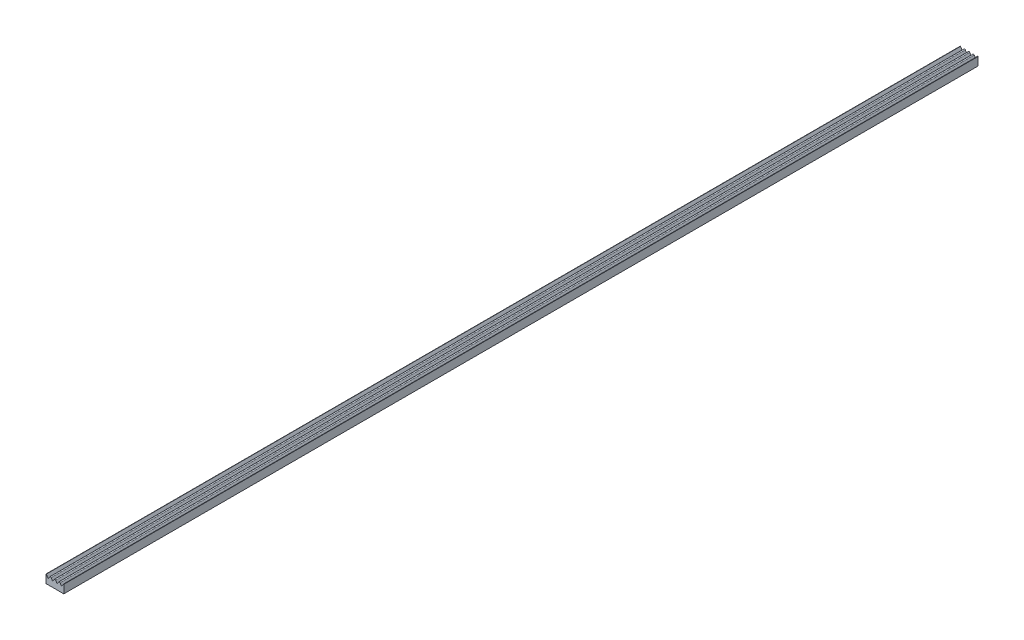
ISO-10303-21;
HEADER;
FILE_DESCRIPTION(('STEP AP214'),'2;1');
FILE_NAME('part.step','',(''),(''),'','','');
FILE_SCHEMA(('AUTOMOTIVE_DESIGN { 1 0 10303 214 1 1 1 1 }'));
ENDSEC;
DATA;
#1=APPLICATION_CONTEXT('core data for automotive mechanical design processes');
#2=APPLICATION_PROTOCOL_DEFINITION('international standard','automotive_design',2000,#1);
#3=PRODUCT_CONTEXT('',#1,'mechanical');
#4=PRODUCT('Part','Part','',(#3));
#5=PRODUCT_RELATED_PRODUCT_CATEGORY('part','',(#4));
#6=PRODUCT_DEFINITION_FORMATION('','',#4);
#7=PRODUCT_DEFINITION_CONTEXT('part definition',#1,'design');
#8=PRODUCT_DEFINITION('design','',#6,#7);
#9=PRODUCT_DEFINITION_SHAPE('','',#8);
#10=(LENGTH_UNIT() NAMED_UNIT(*) SI_UNIT(.MILLI.,.METRE.));
#11=(NAMED_UNIT(*) PLANE_ANGLE_UNIT() SI_UNIT($,.RADIAN.));
#12=(NAMED_UNIT(*) SI_UNIT($,.STERADIAN.) SOLID_ANGLE_UNIT());
#13=UNCERTAINTY_MEASURE_WITH_UNIT(LENGTH_MEASURE(1.E-05),#10,'distance_accuracy_value','');
#14=(GEOMETRIC_REPRESENTATION_CONTEXT(3) GLOBAL_UNCERTAINTY_ASSIGNED_CONTEXT((#13)) GLOBAL_UNIT_ASSIGNED_CONTEXT((#10,
#11,#12)) REPRESENTATION_CONTEXT('',''));
#15=CARTESIAN_POINT('',(0.,0.,0.));
#16=DIRECTION('',(0.,0.,1.));
#17=DIRECTION('',(1.,0.,0.));
#18=AXIS2_PLACEMENT_3D('',#15,#16,#17);
#19=CARTESIAN_POINT('',(0.,0.,652.145));
#20=DIRECTION('',(-1.,0.,0.));
#21=DIRECTION('',(0.,0.,1.));
#22=AXIS2_PLACEMENT_3D('',#19,#20,#21);
#23=PLANE('',#22);
#24=DIRECTION('',(0.,1.,0.));
#25=VECTOR('',#24,1.);
#26=CARTESIAN_POINT('',(0.,0.,0.));
#27=LINE('',#26,#25);
#28=CARTESIAN_POINT('',(0.,0.,0.));
#29=VERTEX_POINT('',#28);
#30=CARTESIAN_POINT('',(0.,5.90717687924576,0.));
#31=VERTEX_POINT('',#30);
#32=EDGE_CURVE('E177',#29,#31,#27,.T.);
#33=ORIENTED_EDGE('',*,*,#32,.T.);
#34=DIRECTION('',(0.,0.,-1.));
#35=VECTOR('',#34,1.);
#36=CARTESIAN_POINT('',(0.,5.90717687924576,652.145));
#37=LINE('',#36,#35);
#38=CARTESIAN_POINT('',(0.,5.90717687924576,652.145));
#39=VERTEX_POINT('',#38);
#40=EDGE_CURVE('E11',#39,#31,#37,.T.);
#41=ORIENTED_EDGE('',*,*,#40,.F.);
#42=DIRECTION('',(0.,1.,0.));
#43=VECTOR('',#42,1.);
#44=CARTESIAN_POINT('',(0.,0.,652.145));
#45=LINE('',#44,#43);
#46=CARTESIAN_POINT('',(0.,0.,652.145));
#47=VERTEX_POINT('',#46);
#48=EDGE_CURVE('E207',#47,#39,#45,.T.);
#49=ORIENTED_EDGE('',*,*,#48,.F.);
#50=DIRECTION('',(0.,0.,-1.));
#51=VECTOR('',#50,1.);
#52=CARTESIAN_POINT('',(0.,0.,652.145));
#53=LINE('',#52,#51);
#54=EDGE_CURVE('E173',#47,#29,#53,.T.);
#55=ORIENTED_EDGE('',*,*,#54,.T.);
#56=EDGE_LOOP('',(#33,#41,#49,#55));
#57=FACE_BOUND('',#56,.T.);
#58=ADVANCED_FACE('F33',(#57),#23,.F.);
#59=CARTESIAN_POINT('',(-0.127,5.90717687924576,652.145));
#60=DIRECTION('',(0.,0.,-1.));
#61=DIRECTION('',(-1.,0.,0.));
#62=AXIS2_PLACEMENT_3D('',#59,#60,#61);
#63=CYLINDRICAL_SURFACE('',#62,0.127);
#64=CARTESIAN_POINT('',(-0.127,5.90717687924576,0.));
#65=DIRECTION('',(0.,0.,1.));
#66=DIRECTION('',(1.,0.,0.));
#67=AXIS2_PLACEMENT_3D('',#64,#65,#66);
#68=CIRCLE('',#67,0.127);
#69=CARTESIAN_POINT('',(-0.234695784608649,5.97448674462616,0.));
#70=VERTEX_POINT('',#69);
#71=EDGE_CURVE('E180',#31,#70,#68,.T.);
#72=ORIENTED_EDGE('',*,*,#71,.T.);
#73=DIRECTION('',(0.,0.,-1.));
#74=VECTOR('',#73,1.);
#75=CARTESIAN_POINT('',(-0.234695784608649,5.97448674462616,652.145));
#76=LINE('',#75,#74);
#77=CARTESIAN_POINT('',(-0.234695784608649,5.97448674462616,652.145));
#78=VERTEX_POINT('',#77);
#79=EDGE_CURVE('E41',#78,#70,#76,.T.);
#80=ORIENTED_EDGE('',*,*,#79,.F.);
#81=CARTESIAN_POINT('',(-0.127,5.90717687924576,652.145));
#82=DIRECTION('',(0.,0.,1.));
#83=DIRECTION('',(1.,0.,0.));
#84=AXIS2_PLACEMENT_3D('',#81,#82,#83);
#85=CIRCLE('',#84,0.127);
#86=EDGE_CURVE('E116',#39,#78,#85,.T.);
#87=ORIENTED_EDGE('',*,*,#86,.F.);
#88=ORIENTED_EDGE('',*,*,#40,.T.);
#89=EDGE_LOOP('',(#72,#80,#87,#88));
#90=FACE_BOUND('',#89,.T.);
#91=ADVANCED_FACE('F305',(#90),#63,.T.);
#92=CARTESIAN_POINT('',(-1.5875,3.81,652.145));
#93=DIRECTION('',(0.847998304005088,-0.529998940003179,0.));
#94=DIRECTION('',(0.529998940003179,0.847998304005088,0.));
#95=AXIS2_PLACEMENT_3D('',#92,#93,#94);
#96=PLANE('',#95);
#97=DIRECTION('',(-0.529998940003179,-0.847998304005088,0.));
#98=VECTOR('',#97,1.);
#99=CARTESIAN_POINT('',(-1.5875,3.81,0.));
#100=LINE('',#99,#98);
#101=CARTESIAN_POINT('',(-1.5875,3.81,0.));
#102=VERTEX_POINT('',#101);
#103=EDGE_CURVE('E182',#70,#102,#100,.T.);
#104=ORIENTED_EDGE('',*,*,#103,.T.);
#105=DIRECTION('',(0.,0.,-1.));
#106=VECTOR('',#105,1.);
#107=CARTESIAN_POINT('',(-1.5875,3.81,652.145));
#108=LINE('',#107,#106);
#109=CARTESIAN_POINT('',(-1.5875,3.81,652.145));
#110=VERTEX_POINT('',#109);
#111=EDGE_CURVE('E238',#110,#102,#108,.T.);
#112=ORIENTED_EDGE('',*,*,#111,.F.);
#113=DIRECTION('',(-0.529998940003179,-0.847998304005088,0.));
#114=VECTOR('',#113,1.);
#115=CARTESIAN_POINT('',(-1.5875,3.81,652.145));
#116=LINE('',#115,#114);
#117=EDGE_CURVE('E246',#78,#110,#116,.T.);
#118=ORIENTED_EDGE('',*,*,#117,.F.);
#119=ORIENTED_EDGE('',*,*,#79,.T.);
#120=EDGE_LOOP('',(#104,#112,#118,#119));
#121=FACE_BOUND('',#120,.T.);
#122=ADVANCED_FACE('F244',(#121),#96,.F.);
#123=CARTESIAN_POINT('',(-2.63652107695677,5.48843372313082,652.145));
#124=DIRECTION('',(-0.847998304005088,-0.52999894000318,0.));
#125=DIRECTION('',(0.52999894000318,-0.847998304005088,0.));
#126=AXIS2_PLACEMENT_3D('',#123,#124,#125);
#127=PLANE('',#126);
#128=DIRECTION('',(-0.52999894000318,0.847998304005088,0.));
#129=VECTOR('',#128,1.);
#130=CARTESIAN_POINT('',(-2.63652107695677,5.48843372313082,0.));
#131=LINE('',#130,#129);
#132=CARTESIAN_POINT('',(-2.63652107695677,5.48843372313082,0.));
#133=VERTEX_POINT('',#132);
#134=EDGE_CURVE('E184',#102,#133,#131,.T.);
#135=ORIENTED_EDGE('',*,*,#134,.T.);
#136=DIRECTION('',(0.,0.,-1.));
#137=VECTOR('',#136,1.);
#138=CARTESIAN_POINT('',(-2.63652107695677,5.48843372313082,652.145));
#139=LINE('',#138,#137);
#140=CARTESIAN_POINT('',(-2.63652107695677,5.48843372313082,652.145));
#141=VERTEX_POINT('',#140);
#142=EDGE_CURVE('E235',#141,#133,#139,.T.);
#143=ORIENTED_EDGE('',*,*,#142,.F.);
#144=DIRECTION('',(-0.52999894000318,0.847998304005088,0.));
#145=VECTOR('',#144,1.);
#146=CARTESIAN_POINT('',(-2.63652107695677,5.48843372313082,652.145));
#147=LINE('',#146,#145);
#148=EDGE_CURVE('E264',#110,#141,#147,.T.);
#149=ORIENTED_EDGE('',*,*,#148,.F.);
#150=ORIENTED_EDGE('',*,*,#111,.T.);
#151=EDGE_LOOP('',(#135,#143,#149,#150));
#152=FACE_BOUND('',#151,.T.);
#153=ADVANCED_FACE('F255',(#152),#127,.F.);
#154=CARTESIAN_POINT('',(-3.175,5.15188439622881,652.145));
#155=DIRECTION('',(0.,0.,-1.));
#156=DIRECTION('',(-1.,0.,0.));
#157=AXIS2_PLACEMENT_3D('',#154,#155,#156);
#158=CYLINDRICAL_SURFACE('',#157,0.635);
#159=CARTESIAN_POINT('',(-3.175,5.15188439622881,0.));
#160=DIRECTION('',(0.,0.,1.));
#161=DIRECTION('',(-1.,0.,0.));
#162=AXIS2_PLACEMENT_3D('',#159,#160,#161);
#163=CIRCLE('',#162,0.635);
#164=CARTESIAN_POINT('',(-3.71347892304324,5.48843372313082,0.));
#165=VERTEX_POINT('',#164);
#166=EDGE_CURVE('E186',#133,#165,#163,.T.);
#167=ORIENTED_EDGE('',*,*,#166,.T.);
#168=DIRECTION('',(0.,0.,-1.));
#169=VECTOR('',#168,1.);
#170=CARTESIAN_POINT('',(-3.71347892304324,5.48843372313082,652.145));
#171=LINE('',#170,#169);
#172=CARTESIAN_POINT('',(-3.71347892304324,5.48843372313082,652.145));
#173=VERTEX_POINT('',#172);
#174=EDGE_CURVE('E232',#173,#165,#171,.T.);
#175=ORIENTED_EDGE('',*,*,#174,.F.);
#176=CARTESIAN_POINT('',(-3.175,5.15188439622881,652.145));
#177=DIRECTION('',(0.,0.,1.));
#178=DIRECTION('',(-1.,0.,0.));
#179=AXIS2_PLACEMENT_3D('',#176,#177,#178);
#180=CIRCLE('',#179,0.635);
#181=EDGE_CURVE('E261',#141,#173,#180,.T.);
#182=ORIENTED_EDGE('',*,*,#181,.F.);
#183=ORIENTED_EDGE('',*,*,#142,.T.);
#184=EDGE_LOOP('',(#167,#175,#182,#183));
#185=FACE_BOUND('',#184,.T.);
#186=ADVANCED_FACE('F259',(#185),#158,.T.);
#187=CARTESIAN_POINT('',(-4.7625,3.81,652.145));
#188=DIRECTION('',(0.847998304005088,-0.52999894000318,0.));
#189=DIRECTION('',(0.52999894000318,0.847998304005088,0.));
#190=AXIS2_PLACEMENT_3D('',#187,#188,#189);
#191=PLANE('',#190);
#192=DIRECTION('',(-0.52999894000318,-0.847998304005088,0.));
#193=VECTOR('',#192,1.);
#194=CARTESIAN_POINT('',(-4.7625,3.81,0.));
#195=LINE('',#194,#193);
#196=CARTESIAN_POINT('',(-4.7625,3.81,0.));
#197=VERTEX_POINT('',#196);
#198=EDGE_CURVE('E188',#165,#197,#195,.T.);
#199=ORIENTED_EDGE('',*,*,#198,.T.);
#200=DIRECTION('',(0.,0.,-1.));
#201=VECTOR('',#200,1.);
#202=CARTESIAN_POINT('',(-4.7625,3.81,652.145));
#203=LINE('',#202,#201);
#204=CARTESIAN_POINT('',(-4.7625,3.81,652.145));
#205=VERTEX_POINT('',#204);
#206=EDGE_CURVE('E229',#205,#197,#203,.T.);
#207=ORIENTED_EDGE('',*,*,#206,.F.);
#208=DIRECTION('',(-0.52999894000318,-0.847998304005088,0.));
#209=VECTOR('',#208,1.);
#210=CARTESIAN_POINT('',(-4.7625,3.81,652.145));
#211=LINE('',#210,#209);
#212=EDGE_CURVE('E263',#173,#205,#211,.T.);
#213=ORIENTED_EDGE('',*,*,#212,.F.);
#214=ORIENTED_EDGE('',*,*,#174,.T.);
#215=EDGE_LOOP('',(#199,#207,#213,#214));
#216=FACE_BOUND('',#215,.T.);
#217=ADVANCED_FACE('F318',(#216),#191,.F.);
#218=CARTESIAN_POINT('',(-4.7625,3.81,652.145));
#219=DIRECTION('',(-0.847998304005088,-0.52999894000318,0.));
#220=DIRECTION('',(0.52999894000318,-0.847998304005088,0.));
#221=AXIS2_PLACEMENT_3D('',#218,#219,#220);
#222=PLANE('',#221);
#223=DIRECTION('',(-0.52999894000318,0.847998304005088,0.));
#224=VECTOR('',#223,1.);
#225=CARTESIAN_POINT('',(-4.7625,3.81,0.));
#226=LINE('',#225,#224);
#227=CARTESIAN_POINT('',(-5.81152107695676,5.48843372313082,0.));
#228=VERTEX_POINT('',#227);
#229=EDGE_CURVE('E190',#197,#228,#226,.T.);
#230=ORIENTED_EDGE('',*,*,#229,.T.);
#231=DIRECTION('',(0.,0.,-1.));
#232=VECTOR('',#231,1.);
#233=CARTESIAN_POINT('',(-5.81152107695676,5.48843372313082,652.145));
#234=LINE('',#233,#232);
#235=CARTESIAN_POINT('',(-5.81152107695676,5.48843372313082,652.145));
#236=VERTEX_POINT('',#235);
#237=EDGE_CURVE('E226',#236,#228,#234,.T.);
#238=ORIENTED_EDGE('',*,*,#237,.F.);
#239=DIRECTION('',(-0.52999894000318,0.847998304005088,0.));
#240=VECTOR('',#239,1.);
#241=CARTESIAN_POINT('',(-4.7625,3.81,652.145));
#242=LINE('',#241,#240);
#243=EDGE_CURVE('E266',#205,#236,#242,.T.);
#244=ORIENTED_EDGE('',*,*,#243,.F.);
#245=ORIENTED_EDGE('',*,*,#206,.T.);
#246=EDGE_LOOP('',(#230,#238,#244,#245));
#247=FACE_BOUND('',#246,.T.);
#248=ADVANCED_FACE('F321',(#247),#222,.F.);
#249=CARTESIAN_POINT('',(-6.35,5.15188439622881,652.145));
#250=DIRECTION('',(0.,0.,-1.));
#251=DIRECTION('',(-1.,0.,0.));
#252=AXIS2_PLACEMENT_3D('',#249,#250,#251);
#253=CYLINDRICAL_SURFACE('',#252,0.635);
#254=CARTESIAN_POINT('',(-6.35,5.15188439622881,0.));
#255=DIRECTION('',(0.,0.,1.));
#256=DIRECTION('',(-1.,0.,0.));
#257=AXIS2_PLACEMENT_3D('',#254,#255,#256);
#258=CIRCLE('',#257,0.635);
#259=CARTESIAN_POINT('',(-6.88847892304323,5.48843372313082,0.));
#260=VERTEX_POINT('',#259);
#261=EDGE_CURVE('E192',#228,#260,#258,.T.);
#262=ORIENTED_EDGE('',*,*,#261,.T.);
#263=DIRECTION('',(0.,0.,-1.));
#264=VECTOR('',#263,1.);
#265=CARTESIAN_POINT('',(-6.88847892304323,5.48843372313082,652.145));
#266=LINE('',#265,#264);
#267=CARTESIAN_POINT('',(-6.88847892304323,5.48843372313082,652.145));
#268=VERTEX_POINT('',#267);
#269=EDGE_CURVE('E223',#268,#260,#266,.T.);
#270=ORIENTED_EDGE('',*,*,#269,.F.);
#271=CARTESIAN_POINT('',(-6.35,5.15188439622881,652.145));
#272=DIRECTION('',(0.,0.,1.));
#273=DIRECTION('',(-1.,0.,0.));
#274=AXIS2_PLACEMENT_3D('',#271,#272,#273);
#275=CIRCLE('',#274,0.635);
#276=EDGE_CURVE('E272',#236,#268,#275,.T.);
#277=ORIENTED_EDGE('',*,*,#276,.F.);
#278=ORIENTED_EDGE('',*,*,#237,.T.);
#279=EDGE_LOOP('',(#262,#270,#277,#278));
#280=FACE_BOUND('',#279,.T.);
#281=ADVANCED_FACE('F325',(#280),#253,.T.);
#282=CARTESIAN_POINT('',(-7.9375,3.81,652.145));
#283=DIRECTION('',(0.847998304005088,-0.52999894000318,0.));
#284=DIRECTION('',(0.52999894000318,0.847998304005088,0.));
#285=AXIS2_PLACEMENT_3D('',#282,#283,#284);
#286=PLANE('',#285);
#287=DIRECTION('',(-0.52999894000318,-0.847998304005088,0.));
#288=VECTOR('',#287,1.);
#289=CARTESIAN_POINT('',(-7.9375,3.81,0.));
#290=LINE('',#289,#288);
#291=CARTESIAN_POINT('',(-7.9375,3.81,0.));
#292=VERTEX_POINT('',#291);
#293=EDGE_CURVE('E194',#260,#292,#290,.T.);
#294=ORIENTED_EDGE('',*,*,#293,.T.);
#295=DIRECTION('',(0.,0.,-1.));
#296=VECTOR('',#295,1.);
#297=CARTESIAN_POINT('',(-7.9375,3.81,652.145));
#298=LINE('',#297,#296);
#299=CARTESIAN_POINT('',(-7.9375,3.81,652.145));
#300=VERTEX_POINT('',#299);
#301=EDGE_CURVE('E220',#300,#292,#298,.T.);
#302=ORIENTED_EDGE('',*,*,#301,.F.);
#303=DIRECTION('',(-0.52999894000318,-0.847998304005088,0.));
#304=VECTOR('',#303,1.);
#305=CARTESIAN_POINT('',(-7.9375,3.81,652.145));
#306=LINE('',#305,#304);
#307=EDGE_CURVE('E274',#268,#300,#306,.T.);
#308=ORIENTED_EDGE('',*,*,#307,.F.);
#309=ORIENTED_EDGE('',*,*,#269,.T.);
#310=EDGE_LOOP('',(#294,#302,#308,#309));
#311=FACE_BOUND('',#310,.T.);
#312=ADVANCED_FACE('F329',(#311),#286,.F.);
#313=CARTESIAN_POINT('',(-7.9375,3.81,652.145));
#314=DIRECTION('',(-0.847998304005088,-0.52999894000318,0.));
#315=DIRECTION('',(0.52999894000318,-0.847998304005088,0.));
#316=AXIS2_PLACEMENT_3D('',#313,#314,#315);
#317=PLANE('',#316);
#318=DIRECTION('',(-0.52999894000318,0.847998304005088,0.));
#319=VECTOR('',#318,1.);
#320=CARTESIAN_POINT('',(-7.9375,3.81,0.));
#321=LINE('',#320,#319);
#322=CARTESIAN_POINT('',(-8.98652107695676,5.48843372313082,0.));
#323=VERTEX_POINT('',#322);
#324=EDGE_CURVE('E196',#292,#323,#321,.T.);
#325=ORIENTED_EDGE('',*,*,#324,.T.);
#326=DIRECTION('',(0.,0.,-1.));
#327=VECTOR('',#326,1.);
#328=CARTESIAN_POINT('',(-8.98652107695676,5.48843372313082,652.145));
#329=LINE('',#328,#327);
#330=CARTESIAN_POINT('',(-8.98652107695676,5.48843372313082,652.145));
#331=VERTEX_POINT('',#330);
#332=EDGE_CURVE('E217',#331,#323,#329,.T.);
#333=ORIENTED_EDGE('',*,*,#332,.F.);
#334=DIRECTION('',(-0.52999894000318,0.847998304005088,0.));
#335=VECTOR('',#334,1.);
#336=CARTESIAN_POINT('',(-7.9375,3.81,652.145));
#337=LINE('',#336,#335);
#338=EDGE_CURVE('E276',#300,#331,#337,.T.);
#339=ORIENTED_EDGE('',*,*,#338,.F.);
#340=ORIENTED_EDGE('',*,*,#301,.T.);
#341=EDGE_LOOP('',(#325,#333,#339,#340));
#342=FACE_BOUND('',#341,.T.);
#343=ADVANCED_FACE('F333',(#342),#317,.F.);
#344=CARTESIAN_POINT('',(-9.525,5.15188439622881,652.145));
#345=DIRECTION('',(0.,0.,-1.));
#346=DIRECTION('',(-1.,0.,0.));
#347=AXIS2_PLACEMENT_3D('',#344,#345,#346);
#348=CYLINDRICAL_SURFACE('',#347,0.635);
#349=CARTESIAN_POINT('',(-9.525,5.15188439622881,0.));
#350=DIRECTION('',(0.,0.,1.));
#351=DIRECTION('',(1.,0.,0.));
#352=AXIS2_PLACEMENT_3D('',#349,#350,#351);
#353=CIRCLE('',#352,0.635);
#354=CARTESIAN_POINT('',(-10.0634789230432,5.48843372313082,0.));
#355=VERTEX_POINT('',#354);
#356=EDGE_CURVE('E198',#323,#355,#353,.T.);
#357=ORIENTED_EDGE('',*,*,#356,.T.);
#358=DIRECTION('',(0.,0.,-1.));
#359=VECTOR('',#358,1.);
#360=CARTESIAN_POINT('',(-10.0634789230432,5.48843372313082,652.145));
#361=LINE('',#360,#359);
#362=CARTESIAN_POINT('',(-10.0634789230432,5.48843372313082,652.145));
#363=VERTEX_POINT('',#362);
#364=EDGE_CURVE('E214',#363,#355,#361,.T.);
#365=ORIENTED_EDGE('',*,*,#364,.F.);
#366=CARTESIAN_POINT('',(-9.525,5.15188439622881,652.145));
#367=DIRECTION('',(0.,0.,1.));
#368=DIRECTION('',(1.,0.,0.));
#369=AXIS2_PLACEMENT_3D('',#366,#367,#368);
#370=CIRCLE('',#369,0.635);
#371=EDGE_CURVE('E278',#331,#363,#370,.T.);
#372=ORIENTED_EDGE('',*,*,#371,.F.);
#373=ORIENTED_EDGE('',*,*,#332,.T.);
#374=EDGE_LOOP('',(#357,#365,#372,#373));
#375=FACE_BOUND('',#374,.T.);
#376=ADVANCED_FACE('F337',(#375),#348,.T.);
#377=CARTESIAN_POINT('',(-10.0634789230432,5.48843372313082,652.145));
#378=DIRECTION('',(0.847998304005088,-0.52999894000318,0.));
#379=DIRECTION('',(0.52999894000318,0.847998304005088,0.));
#380=AXIS2_PLACEMENT_3D('',#377,#378,#379);
#381=PLANE('',#380);
#382=DIRECTION('',(-0.52999894000318,-0.847998304005088,0.));
#383=VECTOR('',#382,1.);
#384=CARTESIAN_POINT('',(-10.0634789230432,5.48843372313082,0.));
#385=LINE('',#384,#383);
#386=CARTESIAN_POINT('',(-11.1125,3.81,0.));
#387=VERTEX_POINT('',#386);
#388=EDGE_CURVE('E200',#355,#387,#385,.T.);
#389=ORIENTED_EDGE('',*,*,#388,.T.);
#390=DIRECTION('',(0.,0.,-1.));
#391=VECTOR('',#390,1.);
#392=CARTESIAN_POINT('',(-11.1125,3.81,652.145));
#393=LINE('',#392,#391);
#394=CARTESIAN_POINT('',(-11.1125,3.81,652.145));
#395=VERTEX_POINT('',#394);
#396=EDGE_CURVE('E211',#395,#387,#393,.T.);
#397=ORIENTED_EDGE('',*,*,#396,.F.);
#398=DIRECTION('',(-0.52999894000318,-0.847998304005088,0.));
#399=VECTOR('',#398,1.);
#400=CARTESIAN_POINT('',(-10.0634789230432,5.48843372313082,652.145));
#401=LINE('',#400,#399);
#402=EDGE_CURVE('E280',#363,#395,#401,.T.);
#403=ORIENTED_EDGE('',*,*,#402,.F.);
#404=ORIENTED_EDGE('',*,*,#364,.T.);
#405=EDGE_LOOP('',(#389,#397,#403,#404));
#406=FACE_BOUND('',#405,.T.);
#407=ADVANCED_FACE('F286',(#406),#381,.F.);
#408=CARTESIAN_POINT('',(-11.1125,3.81,652.145));
#409=DIRECTION('',(-0.847998304005088,-0.52999894000318,0.));
#410=DIRECTION('',(0.52999894000318,-0.847998304005088,0.));
#411=AXIS2_PLACEMENT_3D('',#408,#409,#410);
#412=PLANE('',#411);
#413=DIRECTION('',(-0.52999894000318,0.847998304005088,0.));
#414=VECTOR('',#413,1.);
#415=CARTESIAN_POINT('',(-11.1125,3.81,0.));
#416=LINE('',#415,#414);
#417=CARTESIAN_POINT('',(-12.4653042153914,5.97448674462616,0.));
#418=VERTEX_POINT('',#417);
#419=EDGE_CURVE('E202',#387,#418,#416,.T.);
#420=ORIENTED_EDGE('',*,*,#419,.T.);
#421=DIRECTION('',(0.,0.,-1.));
#422=VECTOR('',#421,1.);
#423=CARTESIAN_POINT('',(-12.4653042153914,5.97448674462616,652.145));
#424=LINE('',#423,#422);
#425=CARTESIAN_POINT('',(-12.4653042153914,5.97448674462616,652.145));
#426=VERTEX_POINT('',#425);
#427=EDGE_CURVE('E168',#426,#418,#424,.T.);
#428=ORIENTED_EDGE('',*,*,#427,.F.);
#429=DIRECTION('',(-0.52999894000318,0.847998304005088,0.));
#430=VECTOR('',#429,1.);
#431=CARTESIAN_POINT('',(-11.1125,3.81,652.145));
#432=LINE('',#431,#430);
#433=EDGE_CURVE('E159',#395,#426,#432,.T.);
#434=ORIENTED_EDGE('',*,*,#433,.F.);
#435=ORIENTED_EDGE('',*,*,#396,.T.);
#436=EDGE_LOOP('',(#420,#428,#434,#435));
#437=FACE_BOUND('',#436,.T.);
#438=ADVANCED_FACE('F290',(#437),#412,.F.);
#439=CARTESIAN_POINT('',(-12.573,5.90717687924576,652.145));
#440=DIRECTION('',(0.,0.,-1.));
#441=DIRECTION('',(-1.,0.,0.));
#442=AXIS2_PLACEMENT_3D('',#439,#440,#441);
#443=CYLINDRICAL_SURFACE('',#442,0.127);
#444=CARTESIAN_POINT('',(-12.573,5.90717687924576,0.));
#445=DIRECTION('',(0.,0.,1.));
#446=DIRECTION('',(1.,0.,0.));
#447=AXIS2_PLACEMENT_3D('',#444,#445,#446);
#448=CIRCLE('',#447,0.127);
#449=CARTESIAN_POINT('',(-12.7,5.90717687924575,0.));
#450=VERTEX_POINT('',#449);
#451=EDGE_CURVE('E167',#418,#450,#448,.T.);
#452=ORIENTED_EDGE('',*,*,#451,.T.);
#453=DIRECTION('',(0.,0.,-1.));
#454=VECTOR('',#453,1.);
#455=CARTESIAN_POINT('',(-12.7,5.90717687924575,652.145));
#456=LINE('',#455,#454);
#457=CARTESIAN_POINT('',(-12.7,5.90717687924575,652.145));
#458=VERTEX_POINT('',#457);
#459=EDGE_CURVE('E164',#458,#450,#456,.T.);
#460=ORIENTED_EDGE('',*,*,#459,.F.);
#461=CARTESIAN_POINT('',(-12.573,5.90717687924576,652.145));
#462=DIRECTION('',(0.,0.,1.));
#463=DIRECTION('',(1.,0.,0.));
#464=AXIS2_PLACEMENT_3D('',#461,#462,#463);
#465=CIRCLE('',#464,0.127);
#466=EDGE_CURVE('E153',#426,#458,#465,.T.);
#467=ORIENTED_EDGE('',*,*,#466,.F.);
#468=ORIENTED_EDGE('',*,*,#427,.T.);
#469=EDGE_LOOP('',(#452,#460,#467,#468));
#470=FACE_BOUND('',#469,.T.);
#471=ADVANCED_FACE('F165',(#470),#443,.T.);
#472=CARTESIAN_POINT('',(-12.7,0.,652.145));
#473=DIRECTION('',(1.,0.,0.));
#474=DIRECTION('',(0.,0.,-1.));
#475=AXIS2_PLACEMENT_3D('',#472,#473,#474);
#476=PLANE('',#475);
#477=DIRECTION('',(0.,-1.,0.));
#478=VECTOR('',#477,1.);
#479=CARTESIAN_POINT('',(-12.7,0.,0.));
#480=LINE('',#479,#478);
#481=CARTESIAN_POINT('',(-12.7,0.,0.));
#482=VERTEX_POINT('',#481);
#483=EDGE_CURVE('E102',#450,#482,#480,.T.);
#484=ORIENTED_EDGE('',*,*,#483,.T.);
#485=DIRECTION('',(0.,0.,-1.));
#486=VECTOR('',#485,1.);
#487=CARTESIAN_POINT('',(-12.7,0.,652.145));
#488=LINE('',#487,#486);
#489=CARTESIAN_POINT('',(-12.7,0.,652.145));
#490=VERTEX_POINT('',#489);
#491=EDGE_CURVE('E169',#490,#482,#488,.T.);
#492=ORIENTED_EDGE('',*,*,#491,.F.);
#493=DIRECTION('',(0.,-1.,0.));
#494=VECTOR('',#493,1.);
#495=CARTESIAN_POINT('',(-12.7,0.,652.145));
#496=LINE('',#495,#494);
#497=EDGE_CURVE('E157',#458,#490,#496,.T.);
#498=ORIENTED_EDGE('',*,*,#497,.F.);
#499=ORIENTED_EDGE('',*,*,#459,.T.);
#500=EDGE_LOOP('',(#484,#492,#498,#499));
#501=FACE_BOUND('',#500,.T.);
#502=ADVANCED_FACE('F171',(#501),#476,.F.);
#503=CARTESIAN_POINT('',(0.,0.,652.145));
#504=DIRECTION('',(0.,1.,0.));
#505=DIRECTION('',(-1.,0.,0.));
#506=AXIS2_PLACEMENT_3D('',#503,#504,#505);
#507=PLANE('',#506);
#508=DIRECTION('',(1.,0.,0.));
#509=VECTOR('',#508,1.);
#510=CARTESIAN_POINT('',(0.,0.,0.));
#511=LINE('',#510,#509);
#512=EDGE_CURVE('E108',#482,#29,#511,.T.);
#513=ORIENTED_EDGE('',*,*,#512,.T.);
#514=ORIENTED_EDGE('',*,*,#54,.F.);
#515=DIRECTION('',(1.,0.,0.));
#516=VECTOR('',#515,1.);
#517=CARTESIAN_POINT('',(0.,0.,652.145));
#518=LINE('',#517,#516);
#519=EDGE_CURVE('E49',#490,#47,#518,.T.);
#520=ORIENTED_EDGE('',*,*,#519,.F.);
#521=ORIENTED_EDGE('',*,*,#491,.T.);
#522=EDGE_LOOP('',(#513,#514,#520,#521));
#523=FACE_BOUND('',#522,.T.);
#524=ADVANCED_FACE('F294',(#523),#507,.F.);
#525=CARTESIAN_POINT('',(-0.127,5.90717687924576,652.145));
#526=DIRECTION('',(0.,0.,1.));
#527=DIRECTION('',(1.,0.,0.));
#528=AXIS2_PLACEMENT_3D('',#525,#526,#527);
#529=PLANE('',#528);
#530=ORIENTED_EDGE('',*,*,#48,.T.);
#531=ORIENTED_EDGE('',*,*,#86,.T.);
#532=ORIENTED_EDGE('',*,*,#117,.T.);
#533=ORIENTED_EDGE('',*,*,#148,.T.);
#534=ORIENTED_EDGE('',*,*,#181,.T.);
#535=ORIENTED_EDGE('',*,*,#212,.T.);
#536=ORIENTED_EDGE('',*,*,#243,.T.);
#537=ORIENTED_EDGE('',*,*,#276,.T.);
#538=ORIENTED_EDGE('',*,*,#307,.T.);
#539=ORIENTED_EDGE('',*,*,#338,.T.);
#540=ORIENTED_EDGE('',*,*,#371,.T.);
#541=ORIENTED_EDGE('',*,*,#402,.T.);
#542=ORIENTED_EDGE('',*,*,#433,.T.);
#543=ORIENTED_EDGE('',*,*,#466,.T.);
#544=ORIENTED_EDGE('',*,*,#497,.T.);
#545=ORIENTED_EDGE('',*,*,#519,.T.);
#546=EDGE_LOOP('',(#530,#531,#532,#533,#534,#535,#536,#537,#538,#539,#540,#541,#542,#543,#544,#545));
#547=FACE_BOUND('',#546,.T.);
#548=ADVANCED_FACE('F155',(#547),#529,.T.);
#549=CARTESIAN_POINT('',(-0.127,5.90717687924576,0.));
#550=DIRECTION('',(0.,0.,1.));
#551=DIRECTION('',(1.,0.,0.));
#552=AXIS2_PLACEMENT_3D('',#549,#550,#551);
#553=PLANE('',#552);
#554=ORIENTED_EDGE('',*,*,#32,.F.);
#555=ORIENTED_EDGE('',*,*,#512,.F.);
#556=ORIENTED_EDGE('',*,*,#483,.F.);
#557=ORIENTED_EDGE('',*,*,#451,.F.);
#558=ORIENTED_EDGE('',*,*,#419,.F.);
#559=ORIENTED_EDGE('',*,*,#388,.F.);
#560=ORIENTED_EDGE('',*,*,#356,.F.);
#561=ORIENTED_EDGE('',*,*,#324,.F.);
#562=ORIENTED_EDGE('',*,*,#293,.F.);
#563=ORIENTED_EDGE('',*,*,#261,.F.);
#564=ORIENTED_EDGE('',*,*,#229,.F.);
#565=ORIENTED_EDGE('',*,*,#198,.F.);
#566=ORIENTED_EDGE('',*,*,#166,.F.);
#567=ORIENTED_EDGE('',*,*,#134,.F.);
#568=ORIENTED_EDGE('',*,*,#103,.F.);
#569=ORIENTED_EDGE('',*,*,#71,.F.);
#570=EDGE_LOOP('',(#554,#555,#556,#557,#558,#559,#560,#561,#562,#563,#564,#565,#566,#567,#568,#569));
#571=FACE_BOUND('',#570,.T.);
#572=ADVANCED_FACE('F250',(#571),#553,.F.);
#573=CLOSED_SHELL('',(#58,#91,#122,#153,#186,#217,#248,#281,#312,#343,#376,#407,#438,#471,#502,
#524,#548,#572));
#574=MANIFOLD_SOLID_BREP('B2',#573);
#575=ADVANCED_BREP_SHAPE_REPRESENTATION('',(#18,#574),#14);
#576=SHAPE_DEFINITION_REPRESENTATION(#9,#575);
ENDSEC;
END-ISO-10303-21;
